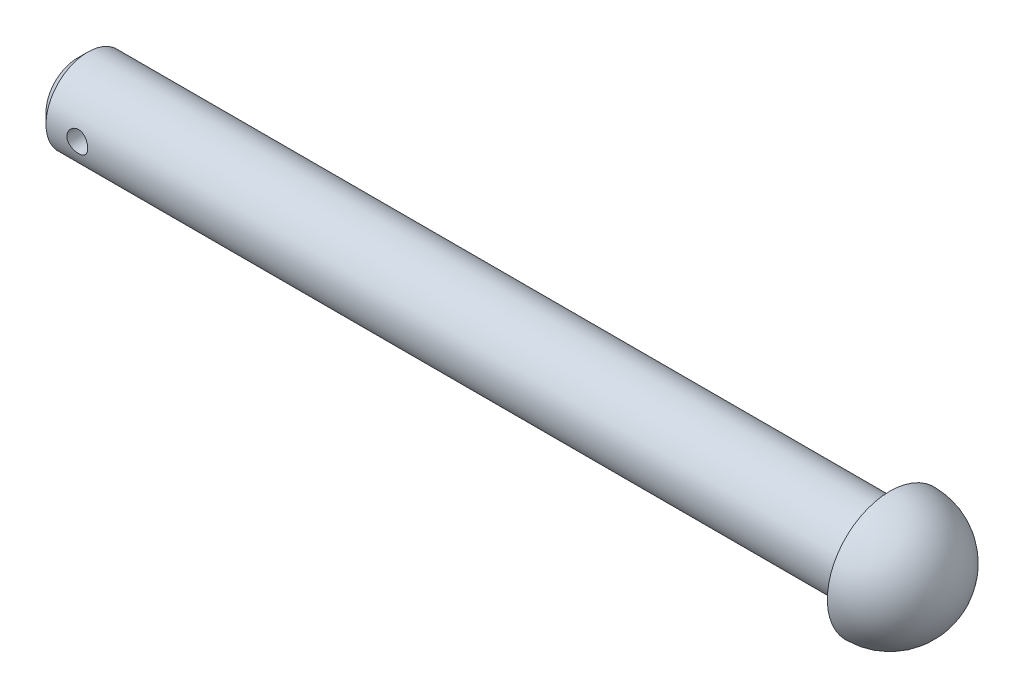
ISO-10303-21;
HEADER;
FILE_DESCRIPTION(('STEP AP214'),'2;1');
FILE_NAME('part.step','',(''),(''),'','','');
FILE_SCHEMA(('AUTOMOTIVE_DESIGN { 1 0 10303 214 1 1 1 1 }'));
ENDSEC;
DATA;
#1=APPLICATION_CONTEXT('core data for automotive mechanical design processes');
#2=APPLICATION_PROTOCOL_DEFINITION('international standard','automotive_design',2000,#1);
#3=PRODUCT_CONTEXT('',#1,'mechanical');
#4=PRODUCT('Part','Part','',(#3));
#5=PRODUCT_RELATED_PRODUCT_CATEGORY('part','',(#4));
#6=PRODUCT_DEFINITION_FORMATION('','',#4);
#7=PRODUCT_DEFINITION_CONTEXT('part definition',#1,'design');
#8=PRODUCT_DEFINITION('design','',#6,#7);
#9=PRODUCT_DEFINITION_SHAPE('','',#8);
#10=(LENGTH_UNIT() NAMED_UNIT(*) SI_UNIT(.MILLI.,.METRE.));
#11=(NAMED_UNIT(*) PLANE_ANGLE_UNIT() SI_UNIT($,.RADIAN.));
#12=(NAMED_UNIT(*) SI_UNIT($,.STERADIAN.) SOLID_ANGLE_UNIT());
#13=UNCERTAINTY_MEASURE_WITH_UNIT(LENGTH_MEASURE(1.E-05),#10,'distance_accuracy_value','');
#14=(GEOMETRIC_REPRESENTATION_CONTEXT(3) GLOBAL_UNCERTAINTY_ASSIGNED_CONTEXT((#13)) GLOBAL_UNIT_ASSIGNED_CONTEXT((#10,
#11,#12)) REPRESENTATION_CONTEXT('',''));
#15=CARTESIAN_POINT('',(0.,0.,0.));
#16=DIRECTION('',(0.,0.,1.));
#17=DIRECTION('',(1.,0.,0.));
#18=AXIS2_PLACEMENT_3D('',#15,#16,#17);
#19=CARTESIAN_POINT('',(0.,0.,0.));
#20=DIRECTION('',(-1.,0.,0.));
#21=DIRECTION('',(0.,-1.,0.));
#22=AXIS2_PLACEMENT_3D('',#19,#20,#21);
#23=PLANE('',#22);
#24=CARTESIAN_POINT('',(0.,0.,0.));
#25=DIRECTION('',(-1.,0.,0.));
#26=DIRECTION('',(0.,-1.,0.));
#27=AXIS2_PLACEMENT_3D('',#24,#25,#26);
#28=CIRCLE('',#27,1.49999999999999);
#29=CARTESIAN_POINT('',(0.,-1.49999999999999,0.));
#30=VERTEX_POINT('',#29);
#31=EDGE_CURVE('E10',#30,#30,#28,.T.);
#32=ORIENTED_EDGE('',*,*,#31,.T.);
#33=EDGE_LOOP('',(#32));
#34=FACE_BOUND('',#33,.T.);
#35=ADVANCED_FACE('F33',(#34),#23,.T.);
#36=CARTESIAN_POINT('',(42.,0.,0.));
#37=DIRECTION('',(1.,0.,0.));
#38=DIRECTION('',(0.,1.,0.));
#39=AXIS2_PLACEMENT_3D('',#36,#37,#38);
#40=CYLINDRICAL_SURFACE('',#39,2.00000000000001);
#41=CARTESIAN_POINT('',(0.500000000000021,0.,0.));
#42=DIRECTION('',(-1.,0.,0.));
#43=DIRECTION('',(0.,-1.,0.));
#44=AXIS2_PLACEMENT_3D('',#41,#42,#43);
#45=CIRCLE('',#44,2.00000000000001);
#46=CARTESIAN_POINT('',(0.50000000000002,-2.00000000000001,0.));
#47=VERTEX_POINT('',#46);
#48=EDGE_CURVE('E41',#47,#47,#45,.F.);
#49=ORIENTED_EDGE('',*,*,#48,.T.);
#50=EDGE_LOOP('',(#49));
#51=FACE_BOUND('',#50,.T.);
#52=CARTESIAN_POINT('',(2.50000000000001,0.,-2.00000000000001));
#53=CARTESIAN_POINT('',(2.49999922475396,-0.0276253628899104,-1.99999953289339));
#54=CARTESIAN_POINT('',(2.49770281640875,-0.0552593859435878,-1.99942192710611));
#55=CARTESIAN_POINT('',(2.48859161623101,-0.109735441256844,-1.99717371276632));
#56=CARTESIAN_POINT('',(2.48177426348739,-0.13657701562358,-1.99550248473324));
#57=CARTESIAN_POINT('',(2.46385358217931,-0.188673624060859,-1.99125208777348));
#58=CARTESIAN_POINT('',(2.45275540042825,-0.213930521143334,-1.98867400947364));
#59=CARTESIAN_POINT('',(2.4266062033184,-0.262224043968142,-1.98288447935866));
#60=CARTESIAN_POINT('',(2.41155505462703,-0.28526059478292,-1.97967300618018));
#61=CARTESIAN_POINT('',(2.37759973678194,-0.328933975766973,-1.97289137863935));
#62=CARTESIAN_POINT('',(2.35862947501362,-0.349518563353691,-1.96931569049512));
#63=CARTESIAN_POINT('',(2.31751593169704,-0.387249642401101,-1.96224540039178));
#64=CARTESIAN_POINT('',(2.29537229235118,-0.404395745649712,-1.95875080762784));
#65=CARTESIAN_POINT('',(2.24813492442086,-0.435008847599677,-1.95218258566571));
#66=CARTESIAN_POINT('',(2.22300225639654,-0.448417405308452,-1.9491159815687));
#67=CARTESIAN_POINT('',(2.17075052944722,-0.470798969516842,-1.94383164937409));
#68=CARTESIAN_POINT('',(2.14363178889142,-0.479772685146444,-1.94161378557598));
#69=CARTESIAN_POINT('',(2.08875216726585,-0.492851612268097,-1.93833492239185));
#70=CARTESIAN_POINT('',(2.06101503465008,-0.497050756111113,-1.9372516369181));
#71=CARTESIAN_POINT('',(2.00521047699535,-0.500753925022617,-1.93629787512582));
#72=CARTESIAN_POINT('',(1.97714310643381,-0.500258713939326,-1.93642720149549));
#73=CARTESIAN_POINT('',(1.92219473075185,-0.49466217487976,-1.93786401832207));
#74=CARTESIAN_POINT('',(1.89530145951164,-0.489672780063507,-1.93914287667294));
#75=CARTESIAN_POINT('',(1.84274631636291,-0.475408062301035,-1.94268903225496));
#76=CARTESIAN_POINT('',(1.81708453232368,-0.466132434023141,-1.94495639990233));
#77=CARTESIAN_POINT('',(1.76742066124932,-0.443463159312384,-1.95025037968063));
#78=CARTESIAN_POINT('',(1.74343794273682,-0.430028889077637,-1.95328442489808));
#79=CARTESIAN_POINT('',(1.69802709674773,-0.399452092004985,-1.9597657028213));
#80=CARTESIAN_POINT('',(1.67659941731092,-0.382308916269613,-1.96321300778246));
#81=CARTESIAN_POINT('',(1.63626546143521,-0.344221141560406,-1.97025293513262));
#82=CARTESIAN_POINT('',(1.61744850331289,-0.323182086055286,-1.97384689825992));
#83=CARTESIAN_POINT('',(1.58359291917871,-0.278203972501233,-1.9806865519293));
#84=CARTESIAN_POINT('',(1.56855440857882,-0.254264825902648,-1.9839322318314));
#85=CARTESIAN_POINT('',(1.54264980459188,-0.204038629560464,-1.98972577364729));
#86=CARTESIAN_POINT('',(1.5317982199152,-0.177743797736207,-1.99227120042576));
#87=CARTESIAN_POINT('',(1.51469423143015,-0.123625336047627,-1.99635972330474));
#88=CARTESIAN_POINT('',(1.50844094786063,-0.0958019997168279,-1.99790301113095));
#89=CARTESIAN_POINT('',(1.50084747814706,-0.0401799901300087,-1.99978499757126));
#90=CARTESIAN_POINT('',(1.49938565797491,-0.0123989066627364,-2.00015351169427));
#91=CARTESIAN_POINT('',(1.50108300068517,0.0430109582671696,-1.99972934938152));
#92=CARTESIAN_POINT('',(1.50424174759972,0.0706397532148652,-1.99893677747283));
#93=CARTESIAN_POINT('',(1.51499030279714,0.124538089592164,-1.99629860375787));
#94=CARTESIAN_POINT('',(1.52251375449234,0.150821706322919,-1.99446878061938));
#95=CARTESIAN_POINT('',(1.54170236134282,0.201752430817504,-1.98996235544713));
#96=CARTESIAN_POINT('',(1.55336793477107,0.226399373010878,-1.98728566789965));
#97=CARTESIAN_POINT('',(1.58074537629159,0.273841044809949,-1.98131102642105));
#98=CARTESIAN_POINT('',(1.59652537079893,0.29659514727861,-1.97800289122312));
#99=CARTESIAN_POINT('',(1.63159663626567,0.339175537881082,-1.97114836395808));
#100=CARTESIAN_POINT('',(1.65088851320564,0.359001319657669,-1.96760193083903));
#101=CARTESIAN_POINT('',(1.69300065361483,0.39566352269091,-1.96056318986925));
#102=CARTESIAN_POINT('',(1.71589590100082,0.412414622540677,-1.95707434729095));
#103=CARTESIAN_POINT('',(1.76424421148858,0.441836919670899,-1.95064292792414));
#104=CARTESIAN_POINT('',(1.78969716098659,0.454508298052646,-1.9477003268901));
#105=CARTESIAN_POINT('',(1.84230190747103,0.475317140203097,-1.9427269824489));
#106=CARTESIAN_POINT('',(1.86944254278135,0.483481465551355,-1.94069085097303));
#107=CARTESIAN_POINT('',(1.92476987929638,0.495115219984593,-1.93775581363396));
#108=CARTESIAN_POINT('',(1.95295635034417,0.498585675826219,-1.93685665906647));
#109=CARTESIAN_POINT('',(2.00870700795174,0.500679530111331,-1.93631633734654));
#110=CARTESIAN_POINT('',(2.03626581170825,0.499439299260039,-1.93663977576089));
#111=CARTESIAN_POINT('',(2.09076796288934,0.492459092770955,-1.93842636335949));
#112=CARTESIAN_POINT('',(2.11771132267123,0.486719207562256,-1.93988948963953));
#113=CARTESIAN_POINT('',(2.17006948635514,0.470977106480931,-1.94377086894242));
#114=CARTESIAN_POINT('',(2.19549243508008,0.461000468226792,-1.94618338412104));
#115=CARTESIAN_POINT('',(2.24432179423791,0.437088304535023,-1.95169251908277));
#116=CARTESIAN_POINT('',(2.26772792439565,0.423152230011396,-1.95478923373592));
#117=CARTESIAN_POINT('',(2.31251820966735,0.391289249545712,-1.96141878087839));
#118=CARTESIAN_POINT('',(2.33383369114133,0.373267720970751,-1.96496088277254));
#119=CARTESIAN_POINT('',(2.37318234826514,0.333929790396578,-1.97202675748763));
#120=CARTESIAN_POINT('',(2.391214743371,0.312612607087048,-1.97555052575688));
#121=CARTESIAN_POINT('',(2.42380376952154,0.266822528900863,-1.98225885215889));
#122=CARTESIAN_POINT('',(2.43829153789054,0.242299474105462,-1.98543611121957));
#123=CARTESIAN_POINT('',(2.46291582098019,0.191088686503492,-1.99101641658374));
#124=CARTESIAN_POINT('',(2.47305545354952,0.16440252114558,-1.99342001733262));
#125=CARTESIAN_POINT('',(2.48719061010989,0.114803417747824,-1.99682686521848));
#126=CARTESIAN_POINT('',(2.49198374768449,0.0921267236360226,-1.99800861684231));
#127=CARTESIAN_POINT('',(2.49838864787399,0.0463020238454276,-1.99959535077317));
#128=CARTESIAN_POINT('',(2.50000064976844,0.0231540537475387,-2.00000039150299));
#129=CARTESIAN_POINT('',(2.50000000000001,0.,-2.00000000000001));
#130=B_SPLINE_CURVE_WITH_KNOTS('',3,(#52,#53,#54,#55,#56,#57,#58,#59,#60,#61,#62,#63,#64,#65,
#66,#67,#68,#69,#70,#71,#72,#73,#74,#75,#76,#77,#78,#79,#80,#81,#82,#83,#84,#85,#86,#87,#88,#89,
#90,#91,#92,#93,#94,#95,#96,#97,#98,#99,#100,#101,#102,#103,#104,#105,#106,#107,#108,#109,#110,
#111,#112,#113,#114,#115,#116,#117,#118,#119,#120,#121,#122,#123,#124,#125,#126,#127,#128,#129),
.UNSPECIFIED.,.T.,.F.,(4,2,2,2,2,2,2,2,2,2,2,2,2,2,2,2,2,2,2,2,2,2,2,2,2,2,2,2,2,2,2,2,2,2,2,2,
2,2,4),(0.,0.0827912374906299,0.165629412587967,0.248368300762035,0.331109980056443,
0.41538145145713,0.49966243193354,0.585195491819357,0.670714870564561,0.754520983664767,
0.838313460375656,0.920074990023393,1.00184234488679,1.08443509291293,1.16704230278721,
1.25200500323006,1.33697029852749,1.42222743003038,1.50746824562881,1.59052769649759,
1.67357967037581,1.75540091504679,1.83723042440763,1.92051195855117,2.0038078766934,
2.08914836401492,2.17448506249836,2.25930751538012,2.34411141084136,2.42647926799537,
2.50884546985345,2.59072133519816,2.67260856045634,2.75663192136637,2.84067523256806,
2.92624061833196,3.01174454607116,3.08114080980716,3.1505318534768),.UNSPECIFIED.);
#131=CARTESIAN_POINT('',(2.50000000000001,0.,-2.00000000000001));
#132=VERTEX_POINT('',#131);
#133=EDGE_CURVE('E52',#132,#132,#130,.T.);
#134=ORIENTED_EDGE('',*,*,#133,.F.);
#135=EDGE_LOOP('',(#134));
#136=FACE_BOUND('',#135,.T.);
#137=CARTESIAN_POINT('',(2.50000000000001,0.,2.00000000000001));
#138=CARTESIAN_POINT('',(2.49999922475396,0.0276253628899104,1.99999953289339));
#139=CARTESIAN_POINT('',(2.49770281640875,0.0552593859435877,1.99942192710611));
#140=CARTESIAN_POINT('',(2.48859161623101,0.109735441256844,1.99717371276632));
#141=CARTESIAN_POINT('',(2.48177426348739,0.13657701562358,1.99550248473324));
#142=CARTESIAN_POINT('',(2.46385358217931,0.188673624060859,1.99125208777348));
#143=CARTESIAN_POINT('',(2.45275540042825,0.213930521143334,1.98867400947363));
#144=CARTESIAN_POINT('',(2.4266062033184,0.262224043968142,1.98288447935866));
#145=CARTESIAN_POINT('',(2.41155505462703,0.28526059478292,1.97967300618018));
#146=CARTESIAN_POINT('',(2.37759973678194,0.328933975766973,1.97289137863935));
#147=CARTESIAN_POINT('',(2.35862947501362,0.349518563353691,1.96931569049512));
#148=CARTESIAN_POINT('',(2.31751593169704,0.387249642401101,1.96224540039178));
#149=CARTESIAN_POINT('',(2.29537229235118,0.404395745649712,1.95875080762784));
#150=CARTESIAN_POINT('',(2.24813492442086,0.435008847599677,1.95218258566571));
#151=CARTESIAN_POINT('',(2.22300225639654,0.448417405308452,1.9491159815687));
#152=CARTESIAN_POINT('',(2.17075052944722,0.470798969516842,1.94383164937409));
#153=CARTESIAN_POINT('',(2.14363178889142,0.479772685146444,1.94161378557598));
#154=CARTESIAN_POINT('',(2.08875216726585,0.492851612268097,1.93833492239185));
#155=CARTESIAN_POINT('',(2.06101503465008,0.497050756111113,1.9372516369181));
#156=CARTESIAN_POINT('',(2.00521047699535,0.500753925022617,1.93629787512582));
#157=CARTESIAN_POINT('',(1.97714310643381,0.500258713939326,1.93642720149549));
#158=CARTESIAN_POINT('',(1.92219473075185,0.49466217487976,1.93786401832207));
#159=CARTESIAN_POINT('',(1.89530145951164,0.489672780063507,1.93914287667294));
#160=CARTESIAN_POINT('',(1.84274631636291,0.475408062301035,1.94268903225496));
#161=CARTESIAN_POINT('',(1.81708453232368,0.466132434023141,1.94495639990233));
#162=CARTESIAN_POINT('',(1.76742066124932,0.443463159312384,1.95025037968063));
#163=CARTESIAN_POINT('',(1.74343794273682,0.430028889077637,1.95328442489808));
#164=CARTESIAN_POINT('',(1.69802709674773,0.399452092004985,1.9597657028213));
#165=CARTESIAN_POINT('',(1.67659941731092,0.382308916269613,1.96321300778246));
#166=CARTESIAN_POINT('',(1.63626546143521,0.344221141560406,1.97025293513262));
#167=CARTESIAN_POINT('',(1.61744850331289,0.323182086055286,1.97384689825992));
#168=CARTESIAN_POINT('',(1.58359291917871,0.278203972501233,1.9806865519293));
#169=CARTESIAN_POINT('',(1.56855440857882,0.254264825902648,1.9839322318314));
#170=CARTESIAN_POINT('',(1.54264980459188,0.204038629560464,1.98972577364729));
#171=CARTESIAN_POINT('',(1.5317982199152,0.177743797736208,1.99227120042576));
#172=CARTESIAN_POINT('',(1.51469423143015,0.123625336047627,1.99635972330474));
#173=CARTESIAN_POINT('',(1.50844094786063,0.095801999716828,1.99790301113095));
#174=CARTESIAN_POINT('',(1.50084747814706,0.0401799901300087,1.99978499757126));
#175=CARTESIAN_POINT('',(1.49938565797491,0.0123989066627364,2.00015351169427));
#176=CARTESIAN_POINT('',(1.50108300068517,-0.0430109582671695,1.99972934938152));
#177=CARTESIAN_POINT('',(1.50424174759972,-0.0706397532148651,1.99893677747283));
#178=CARTESIAN_POINT('',(1.51499030279714,-0.124538089592164,1.99629860375787));
#179=CARTESIAN_POINT('',(1.52251375449234,-0.150821706322918,1.99446878061938));
#180=CARTESIAN_POINT('',(1.54170236134282,-0.201752430817504,1.98996235544713));
#181=CARTESIAN_POINT('',(1.55336793477107,-0.226399373010878,1.98728566789965));
#182=CARTESIAN_POINT('',(1.58074537629159,-0.273841044809949,1.98131102642105));
#183=CARTESIAN_POINT('',(1.59652537079893,-0.29659514727861,1.97800289122312));
#184=CARTESIAN_POINT('',(1.63159663626567,-0.339175537881082,1.97114836395808));
#185=CARTESIAN_POINT('',(1.65088851320564,-0.359001319657669,1.96760193083903));
#186=CARTESIAN_POINT('',(1.69300065361483,-0.39566352269091,1.96056318986925));
#187=CARTESIAN_POINT('',(1.71589590100082,-0.412414622540677,1.95707434729095));
#188=CARTESIAN_POINT('',(1.76424421148858,-0.441836919670899,1.95064292792414));
#189=CARTESIAN_POINT('',(1.78969716098659,-0.454508298052645,1.9477003268901));
#190=CARTESIAN_POINT('',(1.84230190747103,-0.475317140203097,1.9427269824489));
#191=CARTESIAN_POINT('',(1.86944254278135,-0.483481465551355,1.94069085097303));
#192=CARTESIAN_POINT('',(1.92476987929638,-0.495115219984593,1.93775581363396));
#193=CARTESIAN_POINT('',(1.95295635034417,-0.498585675826219,1.93685665906647));
#194=CARTESIAN_POINT('',(2.00870700795174,-0.500679530111331,1.93631633734654));
#195=CARTESIAN_POINT('',(2.03626581170825,-0.499439299260039,1.93663977576089));
#196=CARTESIAN_POINT('',(2.09076796288934,-0.492459092770955,1.93842636335949));
#197=CARTESIAN_POINT('',(2.11771132267123,-0.486719207562256,1.93988948963954));
#198=CARTESIAN_POINT('',(2.17006948635515,-0.470977106480931,1.94377086894242));
#199=CARTESIAN_POINT('',(2.19549243508008,-0.461000468226792,1.94618338412104));
#200=CARTESIAN_POINT('',(2.24432179423791,-0.437088304535023,1.95169251908278));
#201=CARTESIAN_POINT('',(2.26772792439565,-0.423152230011396,1.95478923373592));
#202=CARTESIAN_POINT('',(2.31251820966735,-0.391289249545712,1.96141878087839));
#203=CARTESIAN_POINT('',(2.33383369114133,-0.373267720970751,1.96496088277254));
#204=CARTESIAN_POINT('',(2.37318234826514,-0.333929790396578,1.97202675748763));
#205=CARTESIAN_POINT('',(2.391214743371,-0.312612607087048,1.97555052575688));
#206=CARTESIAN_POINT('',(2.42380376952154,-0.266822528900863,1.98225885215889));
#207=CARTESIAN_POINT('',(2.43829153789054,-0.242299474105462,1.98543611121957));
#208=CARTESIAN_POINT('',(2.46291582098019,-0.191088686503492,1.99101641658374));
#209=CARTESIAN_POINT('',(2.47305545354952,-0.16440252114558,1.99342001733262));
#210=CARTESIAN_POINT('',(2.48719061010989,-0.114803417747824,1.99682686521848));
#211=CARTESIAN_POINT('',(2.49198374768449,-0.0921267236360226,1.99800861684231));
#212=CARTESIAN_POINT('',(2.49838864787399,-0.0463020238454276,1.99959535077317));
#213=CARTESIAN_POINT('',(2.50000064976844,-0.0231540537475387,2.00000039150299));
#214=CARTESIAN_POINT('',(2.50000000000001,0.,2.00000000000001));
#215=B_SPLINE_CURVE_WITH_KNOTS('',3,(#137,#138,#139,#140,#141,#142,#143,#144,#145,#146,#147,
#148,#149,#150,#151,#152,#153,#154,#155,#156,#157,#158,#159,#160,#161,#162,#163,#164,#165,#166,
#167,#168,#169,#170,#171,#172,#173,#174,#175,#176,#177,#178,#179,#180,#181,#182,#183,#184,#185,
#186,#187,#188,#189,#190,#191,#192,#193,#194,#195,#196,#197,#198,#199,#200,#201,#202,#203,#204,
#205,#206,#207,#208,#209,#210,#211,#212,#213,#214),.UNSPECIFIED.,.T.,.F.,(4,2,2,2,2,2,2,2,2,2,2,
2,2,2,2,2,2,2,2,2,2,2,2,2,2,2,2,2,2,2,2,2,2,2,2,2,2,2,4),(0.,0.0827912374906299,
0.165629412587967,0.248368300762035,0.331109980056443,0.41538145145713,0.49966243193354,
0.585195491819357,0.670714870564561,0.754520983664767,0.838313460375656,0.920074990023393,
1.00184234488679,1.08443509291293,1.16704230278721,1.25200500323006,1.33697029852749,
1.42222743003038,1.50746824562881,1.59052769649759,1.67357967037581,1.75540091504679,
1.83723042440763,1.92051195855117,2.0038078766934,2.08914836401492,2.17448506249836,
2.25930751538012,2.34411141084136,2.42647926799537,2.50884546985345,2.59072133519816,
2.67260856045634,2.75663192136637,2.84067523256806,2.92624061833196,3.01174454607116,
3.08114080980716,3.1505318534768),.UNSPECIFIED.);
#216=CARTESIAN_POINT('',(2.50000000000001,0.,2.00000000000001));
#217=VERTEX_POINT('',#216);
#218=EDGE_CURVE('E60',#217,#217,#215,.T.);
#219=ORIENTED_EDGE('',*,*,#218,.F.);
#220=EDGE_LOOP('',(#219));
#221=FACE_BOUND('',#220,.T.);
#222=CARTESIAN_POINT('',(39.,0.,0.));
#223=DIRECTION('',(1.,0.,0.));
#224=DIRECTION('',(0.,1.,0.));
#225=AXIS2_PLACEMENT_3D('',#222,#223,#224);
#226=CIRCLE('',#225,2.00000000000002);
#227=CARTESIAN_POINT('',(39.,2.,0.));
#228=VERTEX_POINT('',#227);
#229=EDGE_CURVE('E45',#228,#228,#226,.T.);
#230=ORIENTED_EDGE('',*,*,#229,.F.);
#231=EDGE_LOOP('',(#230));
#232=FACE_BOUND('',#231,.T.);
#233=ADVANCED_FACE('F64',(#51,#136,#221,#232),#40,.T.);
#234=CARTESIAN_POINT('',(39.,2.,0.));
#235=DIRECTION('',(-1.,0.,0.));
#236=DIRECTION('',(0.,-1.,0.));
#237=AXIS2_PLACEMENT_3D('',#234,#235,#236);
#238=PLANE('',#237);
#239=ORIENTED_EDGE('',*,*,#229,.T.);
#240=EDGE_LOOP('',(#239));
#241=FACE_BOUND('',#240,.T.);
#242=CARTESIAN_POINT('',(39.,0.,0.));
#243=DIRECTION('',(1.,0.,0.));
#244=DIRECTION('',(0.,1.,0.));
#245=AXIS2_PLACEMENT_3D('',#242,#243,#244);
#246=CIRCLE('',#245,3.);
#247=CARTESIAN_POINT('',(39.,2.99999999999998,0.));
#248=VERTEX_POINT('',#247);
#249=EDGE_CURVE('E49',#248,#248,#246,.T.);
#250=ORIENTED_EDGE('',*,*,#249,.F.);
#251=EDGE_LOOP('',(#250));
#252=FACE_BOUND('',#251,.T.);
#253=ADVANCED_FACE('F75',(#241,#252),#238,.T.);
#254=CARTESIAN_POINT('',(39.,0.,0.));
#255=DIRECTION('',(1.,0.,0.));
#256=DIRECTION('',(0.,1.,0.));
#257=AXIS2_PLACEMENT_3D('',#254,#255,#256);
#258=SPHERICAL_SURFACE('',#257,3.);
#259=ORIENTED_EDGE('',*,*,#249,.T.);
#260=EDGE_LOOP('',(#259));
#261=FACE_BOUND('',#260,.T.);
#262=ADVANCED_FACE('F71',(#261),#258,.T.);
#263=CARTESIAN_POINT('',(2.00000000000001,0.,-5.));
#264=DIRECTION('',(0.,0.,1.));
#265=DIRECTION('',(1.,0.,0.));
#266=AXIS2_PLACEMENT_3D('',#263,#264,#265);
#267=CYLINDRICAL_SURFACE('',#266,0.5);
#268=ORIENTED_EDGE('',*,*,#133,.T.);
#269=EDGE_LOOP('',(#268));
#270=FACE_BOUND('',#269,.T.);
#271=ORIENTED_EDGE('',*,*,#218,.T.);
#272=EDGE_LOOP('',(#271));
#273=FACE_BOUND('',#272,.T.);
#274=ADVANCED_FACE('F67',(#270,#273),#267,.F.);
#275=CARTESIAN_POINT('',(0.500000000000021,0.,0.));
#276=DIRECTION('',(1.,0.,0.));
#277=DIRECTION('',(0.,1.,0.));
#278=AXIS2_PLACEMENT_3D('',#275,#276,#277);
#279=CONICAL_SURFACE('',#278,2.00000000000001,0.78539816339745);
#280=ORIENTED_EDGE('',*,*,#31,.F.);
#281=EDGE_LOOP('',(#280));
#282=FACE_BOUND('',#281,.T.);
#283=ORIENTED_EDGE('',*,*,#48,.F.);
#284=EDGE_LOOP('',(#283));
#285=FACE_BOUND('',#284,.T.);
#286=ADVANCED_FACE('F36',(#282,#285),#279,.T.);
#287=CLOSED_SHELL('',(#35,#233,#253,#262,#274,#286));
#288=MANIFOLD_SOLID_BREP('B2',#287);
#289=ADVANCED_BREP_SHAPE_REPRESENTATION('',(#18,#288),#14);
#290=SHAPE_DEFINITION_REPRESENTATION(#9,#289);
ENDSEC;
END-ISO-10303-21;
